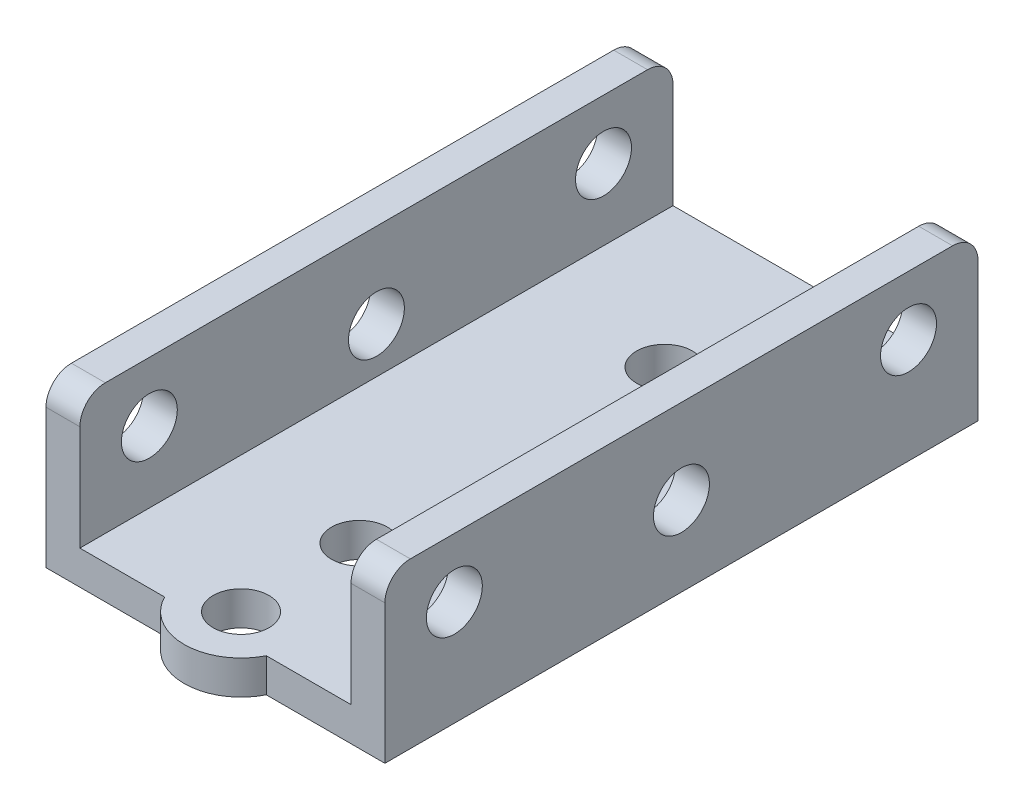
ISO-10303-21;
HEADER;
FILE_DESCRIPTION(('STEP AP214'),'2;1');
FILE_NAME('part.step','',(''),(''),'','','');
FILE_SCHEMA(('AUTOMOTIVE_DESIGN { 1 0 10303 214 1 1 1 1 }'));
ENDSEC;
DATA;
#1=APPLICATION_CONTEXT('core data for automotive mechanical design processes');
#2=APPLICATION_PROTOCOL_DEFINITION('international standard','automotive_design',2000,#1);
#3=PRODUCT_CONTEXT('',#1,'mechanical');
#4=PRODUCT('Part','Part','',(#3));
#5=PRODUCT_RELATED_PRODUCT_CATEGORY('part','',(#4));
#6=PRODUCT_DEFINITION_FORMATION('','',#4);
#7=PRODUCT_DEFINITION_CONTEXT('part definition',#1,'design');
#8=PRODUCT_DEFINITION('design','',#6,#7);
#9=PRODUCT_DEFINITION_SHAPE('','',#8);
#10=(LENGTH_UNIT() NAMED_UNIT(*) SI_UNIT(.MILLI.,.METRE.));
#11=(NAMED_UNIT(*) PLANE_ANGLE_UNIT() SI_UNIT($,.RADIAN.));
#12=(NAMED_UNIT(*) SI_UNIT($,.STERADIAN.) SOLID_ANGLE_UNIT());
#13=UNCERTAINTY_MEASURE_WITH_UNIT(LENGTH_MEASURE(1.E-05),#10,'distance_accuracy_value','');
#14=(GEOMETRIC_REPRESENTATION_CONTEXT(3) GLOBAL_UNCERTAINTY_ASSIGNED_CONTEXT((#13)) GLOBAL_UNIT_ASSIGNED_CONTEXT((#10,
#11,#12)) REPRESENTATION_CONTEXT('',''));
#15=CARTESIAN_POINT('',(0.,0.,0.));
#16=DIRECTION('',(0.,0.,1.));
#17=DIRECTION('',(1.,0.,0.));
#18=AXIS2_PLACEMENT_3D('',#15,#16,#17);
#19=CARTESIAN_POINT('',(0.,2.,17.5));
#20=DIRECTION('',(0.,0.,1.));
#21=DIRECTION('',(1.,0.,0.));
#22=AXIS2_PLACEMENT_3D('',#19,#20,#21);
#23=PLANE('',#22);
#24=DIRECTION('',(0.,1.,0.));
#25=VECTOR('',#24,1.);
#26=CARTESIAN_POINT('',(3.,-6.27831746917603,17.5));
#27=LINE('',#26,#25);
#28=CARTESIAN_POINT('',(3.,0.,17.5));
#29=VERTEX_POINT('',#28);
#30=CARTESIAN_POINT('',(3.,2.,17.5));
#31=VERTEX_POINT('',#30);
#32=EDGE_CURVE('E156',#29,#31,#27,.T.);
#33=ORIENTED_EDGE('',*,*,#32,.F.);
#34=DIRECTION('',(-1.,0.,0.));
#35=VECTOR('',#34,1.);
#36=CARTESIAN_POINT('',(0.,0.,17.5));
#37=LINE('',#36,#35);
#38=CARTESIAN_POINT('',(10.,0.,17.5));
#39=VERTEX_POINT('',#38);
#40=EDGE_CURVE('E204',#39,#29,#37,.T.);
#41=ORIENTED_EDGE('',*,*,#40,.F.);
#42=DIRECTION('',(0.,-1.,0.));
#43=VECTOR('',#42,1.);
#44=CARTESIAN_POINT('',(10.,9.7,17.5));
#45=LINE('',#44,#43);
#46=CARTESIAN_POINT('',(10.,8.2,17.5));
#47=VERTEX_POINT('',#46);
#48=EDGE_CURVE('E203',#47,#39,#45,.T.);
#49=ORIENTED_EDGE('',*,*,#48,.F.);
#50=DIRECTION('',(-1.,0.,0.));
#51=VECTOR('',#50,1.);
#52=CARTESIAN_POINT('',(0.,8.2,17.5));
#53=LINE('',#52,#51);
#54=CARTESIAN_POINT('',(8.,8.2,17.5));
#55=VERTEX_POINT('',#54);
#56=EDGE_CURVE('E54',#47,#55,#53,.T.);
#57=ORIENTED_EDGE('',*,*,#56,.T.);
#58=DIRECTION('',(0.,-1.,0.));
#59=VECTOR('',#58,1.);
#60=CARTESIAN_POINT('',(8.,9.7,17.5));
#61=LINE('',#60,#59);
#62=CARTESIAN_POINT('',(8.,2.,17.5));
#63=VERTEX_POINT('',#62);
#64=EDGE_CURVE('E265',#55,#63,#61,.T.);
#65=ORIENTED_EDGE('',*,*,#64,.T.);
#66=DIRECTION('',(-1.,0.,0.));
#67=VECTOR('',#66,1.);
#68=CARTESIAN_POINT('',(0.,2.,17.5));
#69=LINE('',#68,#67);
#70=EDGE_CURVE('E178',#63,#31,#69,.T.);
#71=ORIENTED_EDGE('',*,*,#70,.T.);
#72=EDGE_LOOP('',(#33,#41,#49,#57,#65,#71));
#73=FACE_BOUND('',#72,.T.);
#74=ADVANCED_FACE('F45',(#73),#23,.T.);
#75=CARTESIAN_POINT('',(0.,2.,-17.5));
#76=DIRECTION('',(0.,0.,1.));
#77=DIRECTION('',(1.,0.,0.));
#78=AXIS2_PLACEMENT_3D('',#75,#76,#77);
#79=PLANE('',#78);
#80=DIRECTION('',(0.,-1.,0.));
#81=VECTOR('',#80,1.);
#82=CARTESIAN_POINT('',(8.,9.7,-17.5));
#83=LINE('',#82,#81);
#84=CARTESIAN_POINT('',(8.,8.2,-17.5));
#85=VERTEX_POINT('',#84);
#86=CARTESIAN_POINT('',(8.,2.,-17.5));
#87=VERTEX_POINT('',#86);
#88=EDGE_CURVE('E275',#85,#87,#83,.T.);
#89=ORIENTED_EDGE('',*,*,#88,.F.);
#90=DIRECTION('',(-1.,0.,0.));
#91=VECTOR('',#90,1.);
#92=CARTESIAN_POINT('',(10.,8.2,-17.5));
#93=LINE('',#92,#91);
#94=CARTESIAN_POINT('',(10.,8.2,-17.5));
#95=VERTEX_POINT('',#94);
#96=EDGE_CURVE('E231',#85,#95,#93,.F.);
#97=ORIENTED_EDGE('',*,*,#96,.T.);
#98=DIRECTION('',(0.,-1.,0.));
#99=VECTOR('',#98,1.);
#100=CARTESIAN_POINT('',(10.,9.7,-17.5));
#101=LINE('',#100,#99);
#102=CARTESIAN_POINT('',(10.,0.,-17.5));
#103=VERTEX_POINT('',#102);
#104=EDGE_CURVE('E280',#95,#103,#101,.T.);
#105=ORIENTED_EDGE('',*,*,#104,.T.);
#106=DIRECTION('',(-1.,0.,0.));
#107=VECTOR('',#106,1.);
#108=CARTESIAN_POINT('',(0.,0.,-17.5));
#109=LINE('',#108,#107);
#110=CARTESIAN_POINT('',(-10.,0.,-17.5));
#111=VERTEX_POINT('',#110);
#112=EDGE_CURVE('E199',#103,#111,#109,.T.);
#113=ORIENTED_EDGE('',*,*,#112,.T.);
#114=DIRECTION('',(0.,-1.,0.));
#115=VECTOR('',#114,1.);
#116=CARTESIAN_POINT('',(-10.,9.7,-17.5));
#117=LINE('',#116,#115);
#118=CARTESIAN_POINT('',(-10.,8.2,-17.5));
#119=VERTEX_POINT('',#118);
#120=EDGE_CURVE('E303',#119,#111,#117,.T.);
#121=ORIENTED_EDGE('',*,*,#120,.F.);
#122=DIRECTION('',(-1.,0.,0.));
#123=VECTOR('',#122,1.);
#124=CARTESIAN_POINT('',(-8.,8.2,-17.5));
#125=LINE('',#124,#123);
#126=CARTESIAN_POINT('',(-8.,8.2,-17.5));
#127=VERTEX_POINT('',#126);
#128=EDGE_CURVE('E228',#119,#127,#125,.F.);
#129=ORIENTED_EDGE('',*,*,#128,.T.);
#130=DIRECTION('',(0.,-1.,0.));
#131=VECTOR('',#130,1.);
#132=CARTESIAN_POINT('',(-8.,9.7,-17.5));
#133=LINE('',#132,#131);
#134=CARTESIAN_POINT('',(-8.,2.,-17.5));
#135=VERTEX_POINT('',#134);
#136=EDGE_CURVE('E297',#127,#135,#133,.T.);
#137=ORIENTED_EDGE('',*,*,#136,.T.);
#138=DIRECTION('',(-1.,0.,0.));
#139=VECTOR('',#138,1.);
#140=CARTESIAN_POINT('',(0.,2.,-17.5));
#141=LINE('',#140,#139);
#142=EDGE_CURVE('E183',#87,#135,#141,.T.);
#143=ORIENTED_EDGE('',*,*,#142,.F.);
#144=EDGE_LOOP('',(#89,#97,#105,#113,#121,#129,#137,#143));
#145=FACE_BOUND('',#144,.T.);
#146=ADVANCED_FACE('F294',(#145),#79,.F.);
#147=DIRECTION('',(0.,1.,0.));
#148=VECTOR('',#147,1.);
#149=CARTESIAN_POINT('',(-3.,-6.27831746917603,17.5));
#150=LINE('',#149,#148);
#151=CARTESIAN_POINT('',(-3.,0.,17.5));
#152=VERTEX_POINT('',#151);
#153=CARTESIAN_POINT('',(-3.,2.,17.5));
#154=VERTEX_POINT('',#153);
#155=EDGE_CURVE('E153',#152,#154,#150,.T.);
#156=ORIENTED_EDGE('',*,*,#155,.T.);
#157=CARTESIAN_POINT('',(-8.,2.,17.5));
#158=VERTEX_POINT('',#157);
#159=EDGE_CURVE('E166',#154,#158,#69,.T.);
#160=ORIENTED_EDGE('',*,*,#159,.T.);
#161=DIRECTION('',(0.,-1.,0.));
#162=VECTOR('',#161,1.);
#163=CARTESIAN_POINT('',(-8.,9.7,17.5));
#164=LINE('',#163,#162);
#165=CARTESIAN_POINT('',(-8.,8.2,17.5));
#166=VERTEX_POINT('',#165);
#167=EDGE_CURVE('E302',#166,#158,#164,.T.);
#168=ORIENTED_EDGE('',*,*,#167,.F.);
#169=DIRECTION('',(-1.,0.,0.));
#170=VECTOR('',#169,1.);
#171=CARTESIAN_POINT('',(0.,8.2,17.5));
#172=LINE('',#171,#170);
#173=CARTESIAN_POINT('',(-10.,8.2,17.5));
#174=VERTEX_POINT('',#173);
#175=EDGE_CURVE('E257',#166,#174,#172,.T.);
#176=ORIENTED_EDGE('',*,*,#175,.T.);
#177=DIRECTION('',(0.,-1.,0.));
#178=VECTOR('',#177,1.);
#179=CARTESIAN_POINT('',(-10.,9.7,17.5));
#180=LINE('',#179,#178);
#181=CARTESIAN_POINT('',(-10.,0.,17.5));
#182=VERTEX_POINT('',#181);
#183=EDGE_CURVE('E307',#174,#182,#180,.T.);
#184=ORIENTED_EDGE('',*,*,#183,.T.);
#185=EDGE_CURVE('E168',#152,#182,#37,.T.);
#186=ORIENTED_EDGE('',*,*,#185,.F.);
#187=EDGE_LOOP('',(#156,#160,#168,#176,#184,#186));
#188=FACE_BOUND('',#187,.T.);
#189=ADVANCED_FACE('F165',(#188),#23,.T.);
#190=CARTESIAN_POINT('',(0.,2.,-9.));
#191=DIRECTION('',(0.,-1.,0.));
#192=DIRECTION('',(0.,0.,-1.));
#193=AXIS2_PLACEMENT_3D('',#190,#191,#192);
#194=CYLINDRICAL_SURFACE('',#193,1.65);
#195=CARTESIAN_POINT('',(0.,2.,-9.));
#196=DIRECTION('',(0.,1.,0.));
#197=DIRECTION('',(0.,0.,1.));
#198=AXIS2_PLACEMENT_3D('',#195,#196,#197);
#199=CIRCLE('',#198,1.65);
#200=CARTESIAN_POINT('',(0.,2.,-7.35));
#201=VERTEX_POINT('',#200);
#202=EDGE_CURVE('E190',#201,#201,#199,.T.);
#203=ORIENTED_EDGE('',*,*,#202,.T.);
#204=EDGE_LOOP('',(#203));
#205=FACE_BOUND('',#204,.T.);
#206=CARTESIAN_POINT('',(0.,0.,-9.));
#207=DIRECTION('',(0.,1.,0.));
#208=DIRECTION('',(0.,0.,1.));
#209=AXIS2_PLACEMENT_3D('',#206,#207,#208);
#210=CIRCLE('',#209,1.65);
#211=CARTESIAN_POINT('',(0.,0.,-7.35));
#212=VERTEX_POINT('',#211);
#213=EDGE_CURVE('E208',#212,#212,#210,.T.);
#214=ORIENTED_EDGE('',*,*,#213,.F.);
#215=EDGE_LOOP('',(#214));
#216=FACE_BOUND('',#215,.T.);
#217=ADVANCED_FACE('F358',(#205,#216),#194,.F.);
#218=CARTESIAN_POINT('',(0.,2.,9.));
#219=DIRECTION('',(0.,-1.,0.));
#220=DIRECTION('',(0.,0.,-1.));
#221=AXIS2_PLACEMENT_3D('',#218,#219,#220);
#222=CYLINDRICAL_SURFACE('',#221,1.65);
#223=CARTESIAN_POINT('',(0.,2.,9.));
#224=DIRECTION('',(0.,1.,0.));
#225=DIRECTION('',(0.,0.,1.));
#226=AXIS2_PLACEMENT_3D('',#223,#224,#225);
#227=CIRCLE('',#226,1.65);
#228=CARTESIAN_POINT('',(0.,2.,10.65));
#229=VERTEX_POINT('',#228);
#230=EDGE_CURVE('E194',#229,#229,#227,.F.);
#231=ORIENTED_EDGE('',*,*,#230,.F.);
#232=EDGE_LOOP('',(#231));
#233=FACE_BOUND('',#232,.T.);
#234=CARTESIAN_POINT('',(0.,0.,9.));
#235=DIRECTION('',(0.,1.,0.));
#236=DIRECTION('',(0.,0.,1.));
#237=AXIS2_PLACEMENT_3D('',#234,#235,#236);
#238=CIRCLE('',#237,1.65);
#239=CARTESIAN_POINT('',(0.,0.,10.65));
#240=VERTEX_POINT('',#239);
#241=EDGE_CURVE('E212',#240,#240,#238,.F.);
#242=ORIENTED_EDGE('',*,*,#241,.T.);
#243=EDGE_LOOP('',(#242));
#244=FACE_BOUND('',#243,.T.);
#245=ADVANCED_FACE('F362',(#233,#244),#222,.F.);
#246=CARTESIAN_POINT('',(0.,2.,0.));
#247=DIRECTION('',(0.,1.,0.));
#248=DIRECTION('',(0.,0.,1.));
#249=AXIS2_PLACEMENT_3D('',#246,#247,#248);
#250=PLANE('',#249);
#251=ORIENTED_EDGE('',*,*,#159,.F.);
#252=CARTESIAN_POINT('',(0.,2.,15.99));
#253=DIRECTION('',(0.,1.,0.));
#254=DIRECTION('',(0.,0.,1.));
#255=AXIS2_PLACEMENT_3D('',#252,#253,#254);
#256=CIRCLE('',#255,3.35858601199969);
#257=EDGE_CURVE('E150',#154,#31,#256,.T.);
#258=ORIENTED_EDGE('',*,*,#257,.T.);
#259=ORIENTED_EDGE('',*,*,#70,.F.);
#260=DIRECTION('',(0.,0.,1.));
#261=VECTOR('',#260,1.);
#262=CARTESIAN_POINT('',(8.,2.,0.));
#263=LINE('',#262,#261);
#264=EDGE_CURVE('E182',#87,#63,#263,.T.);
#265=ORIENTED_EDGE('',*,*,#264,.F.);
#266=ORIENTED_EDGE('',*,*,#142,.T.);
#267=DIRECTION('',(0.,0.,1.));
#268=VECTOR('',#267,1.);
#269=CARTESIAN_POINT('',(-8.,2.,0.));
#270=LINE('',#269,#268);
#271=EDGE_CURVE('E176',#135,#158,#270,.T.);
#272=ORIENTED_EDGE('',*,*,#271,.T.);
#273=EDGE_LOOP('',(#251,#258,#259,#265,#266,#272));
#274=FACE_BOUND('',#273,.T.);
#275=CARTESIAN_POINT('',(0.,2.,15.99));
#276=DIRECTION('',(0.,1.,0.));
#277=DIRECTION('',(0.,0.,1.));
#278=AXIS2_PLACEMENT_3D('',#275,#276,#277);
#279=CIRCLE('',#278,1.65);
#280=CARTESIAN_POINT('',(0.,2.,17.64));
#281=VERTEX_POINT('',#280);
#282=EDGE_CURVE('E420',#281,#281,#279,.T.);
#283=ORIENTED_EDGE('',*,*,#282,.F.);
#284=EDGE_LOOP('',(#283));
#285=FACE_BOUND('',#284,.T.);
#286=ORIENTED_EDGE('',*,*,#202,.F.);
#287=EDGE_LOOP('',(#286));
#288=FACE_BOUND('',#287,.T.);
#289=ORIENTED_EDGE('',*,*,#230,.T.);
#290=EDGE_LOOP('',(#289));
#291=FACE_BOUND('',#290,.T.);
#292=ADVANCED_FACE('F172',(#274,#285,#288,#291),#250,.T.);
#293=CARTESIAN_POINT('',(0.,0.,0.));
#294=DIRECTION('',(0.,1.,0.));
#295=DIRECTION('',(0.,0.,1.));
#296=AXIS2_PLACEMENT_3D('',#293,#294,#295);
#297=PLANE('',#296);
#298=CARTESIAN_POINT('',(0.,0.,15.99));
#299=DIRECTION('',(0.,1.,0.));
#300=DIRECTION('',(0.,0.,1.));
#301=AXIS2_PLACEMENT_3D('',#298,#299,#300);
#302=CIRCLE('',#301,3.35858601199969);
#303=EDGE_CURVE('E418',#29,#152,#302,.F.);
#304=ORIENTED_EDGE('',*,*,#303,.T.);
#305=ORIENTED_EDGE('',*,*,#185,.T.);
#306=DIRECTION('',(0.,0.,-1.));
#307=VECTOR('',#306,1.);
#308=CARTESIAN_POINT('',(-10.,0.,0.));
#309=LINE('',#308,#307);
#310=EDGE_CURVE('E331',#182,#111,#309,.T.);
#311=ORIENTED_EDGE('',*,*,#310,.T.);
#312=ORIENTED_EDGE('',*,*,#112,.F.);
#313=DIRECTION('',(0.,0.,-1.));
#314=VECTOR('',#313,1.);
#315=CARTESIAN_POINT('',(10.,0.,0.));
#316=LINE('',#315,#314);
#317=EDGE_CURVE('E285',#39,#103,#316,.T.);
#318=ORIENTED_EDGE('',*,*,#317,.F.);
#319=ORIENTED_EDGE('',*,*,#40,.T.);
#320=EDGE_LOOP('',(#304,#305,#311,#312,#318,#319));
#321=FACE_BOUND('',#320,.T.);
#322=CARTESIAN_POINT('',(0.,0.,15.99));
#323=DIRECTION('',(0.,1.,0.));
#324=DIRECTION('',(0.,0.,1.));
#325=AXIS2_PLACEMENT_3D('',#322,#323,#324);
#326=CIRCLE('',#325,1.65);
#327=CARTESIAN_POINT('',(0.,0.,17.64));
#328=VERTEX_POINT('',#327);
#329=EDGE_CURVE('E11',#328,#328,#326,.T.);
#330=ORIENTED_EDGE('',*,*,#329,.T.);
#331=EDGE_LOOP('',(#330));
#332=FACE_BOUND('',#331,.T.);
#333=ORIENTED_EDGE('',*,*,#213,.T.);
#334=EDGE_LOOP('',(#333));
#335=FACE_BOUND('',#334,.T.);
#336=ORIENTED_EDGE('',*,*,#241,.F.);
#337=EDGE_LOOP('',(#336));
#338=FACE_BOUND('',#337,.T.);
#339=ADVANCED_FACE('F327',(#321,#332,#335,#338),#297,.F.);
#340=CARTESIAN_POINT('',(8.,9.7,0.));
#341=DIRECTION('',(1.,0.,0.));
#342=DIRECTION('',(0.,0.,-1.));
#343=AXIS2_PLACEMENT_3D('',#340,#341,#342);
#344=PLANE('',#343);
#345=CARTESIAN_POINT('',(8.,6.2,-13.4));
#346=DIRECTION('',(1.,0.,0.));
#347=DIRECTION('',(0.,0.,-1.));
#348=AXIS2_PLACEMENT_3D('',#345,#346,#347);
#349=CIRCLE('',#348,1.65);
#350=CARTESIAN_POINT('',(8.,6.2,-15.05));
#351=VERTEX_POINT('',#350);
#352=EDGE_CURVE('E162',#351,#351,#349,.T.);
#353=ORIENTED_EDGE('',*,*,#352,.T.);
#354=EDGE_LOOP('',(#353));
#355=FACE_BOUND('',#354,.T.);
#356=CARTESIAN_POINT('',(8.,4.7,0.));
#357=DIRECTION('',(1.,0.,0.));
#358=DIRECTION('',(0.,0.,-1.));
#359=AXIS2_PLACEMENT_3D('',#356,#357,#358);
#360=CIRCLE('',#359,1.65);
#361=CARTESIAN_POINT('',(8.,4.7,-1.65000000000001));
#362=VERTEX_POINT('',#361);
#363=EDGE_CURVE('E384',#362,#362,#360,.T.);
#364=ORIENTED_EDGE('',*,*,#363,.T.);
#365=EDGE_LOOP('',(#364));
#366=FACE_BOUND('',#365,.T.);
#367=CARTESIAN_POINT('',(8.,6.2,13.4));
#368=DIRECTION('',(1.,0.,0.));
#369=DIRECTION('',(0.,0.,-1.));
#370=AXIS2_PLACEMENT_3D('',#367,#368,#369);
#371=CIRCLE('',#370,1.65);
#372=CARTESIAN_POINT('',(8.,6.2,11.75));
#373=VERTEX_POINT('',#372);
#374=EDGE_CURVE('E387',#373,#373,#371,.T.);
#375=ORIENTED_EDGE('',*,*,#374,.T.);
#376=EDGE_LOOP('',(#375));
#377=FACE_BOUND('',#376,.T.);
#378=DIRECTION('',(0.,0.,1.));
#379=VECTOR('',#378,1.);
#380=CARTESIAN_POINT('',(8.,9.7,0.));
#381=LINE('',#380,#379);
#382=CARTESIAN_POINT('',(8.,9.7,-16.));
#383=VERTEX_POINT('',#382);
#384=CARTESIAN_POINT('',(8.,9.7,16.));
#385=VERTEX_POINT('',#384);
#386=EDGE_CURVE('E276',#383,#385,#381,.T.);
#387=ORIENTED_EDGE('',*,*,#386,.F.);
#388=CARTESIAN_POINT('',(8.,8.2,-16.));
#389=DIRECTION('',(1.,0.,0.));
#390=DIRECTION('',(0.,0.,-1.));
#391=AXIS2_PLACEMENT_3D('',#388,#389,#390);
#392=CIRCLE('',#391,1.5);
#393=EDGE_CURVE('E225',#383,#85,#392,.F.);
#394=ORIENTED_EDGE('',*,*,#393,.T.);
#395=ORIENTED_EDGE('',*,*,#88,.T.);
#396=ORIENTED_EDGE('',*,*,#264,.T.);
#397=ORIENTED_EDGE('',*,*,#64,.F.);
#398=CARTESIAN_POINT('',(8.,8.2,16.));
#399=DIRECTION('',(1.,0.,0.));
#400=DIRECTION('',(0.,0.,-1.));
#401=AXIS2_PLACEMENT_3D('',#398,#399,#400);
#402=CIRCLE('',#401,1.5);
#403=EDGE_CURVE('E222',#55,#385,#402,.F.);
#404=ORIENTED_EDGE('',*,*,#403,.T.);
#405=EDGE_LOOP('',(#387,#394,#395,#396,#397,#404));
#406=FACE_BOUND('',#405,.T.);
#407=ADVANCED_FACE('F271',(#355,#366,#377,#406),#344,.F.);
#408=CARTESIAN_POINT('',(10.,9.7,0.));
#409=DIRECTION('',(-1.,0.,0.));
#410=DIRECTION('',(0.,0.,1.));
#411=AXIS2_PLACEMENT_3D('',#408,#409,#410);
#412=PLANE('',#411);
#413=CARTESIAN_POINT('',(10.,6.2,-13.4));
#414=DIRECTION('',(-1.,0.,0.));
#415=DIRECTION('',(0.,0.,1.));
#416=AXIS2_PLACEMENT_3D('',#413,#414,#415);
#417=CIRCLE('',#416,1.65);
#418=CARTESIAN_POINT('',(10.,6.2,-11.75));
#419=VERTEX_POINT('',#418);
#420=EDGE_CURVE('E412',#419,#419,#417,.T.);
#421=ORIENTED_EDGE('',*,*,#420,.T.);
#422=EDGE_LOOP('',(#421));
#423=FACE_BOUND('',#422,.T.);
#424=CARTESIAN_POINT('',(10.,4.7,0.));
#425=DIRECTION('',(-1.,0.,0.));
#426=DIRECTION('',(0.,0.,1.));
#427=AXIS2_PLACEMENT_3D('',#424,#425,#426);
#428=CIRCLE('',#427,1.65);
#429=CARTESIAN_POINT('',(10.,4.7,1.64999999999999));
#430=VERTEX_POINT('',#429);
#431=EDGE_CURVE('E396',#430,#430,#428,.T.);
#432=ORIENTED_EDGE('',*,*,#431,.T.);
#433=EDGE_LOOP('',(#432));
#434=FACE_BOUND('',#433,.T.);
#435=CARTESIAN_POINT('',(10.,6.2,13.4));
#436=DIRECTION('',(-1.,0.,0.));
#437=DIRECTION('',(0.,0.,1.));
#438=AXIS2_PLACEMENT_3D('',#435,#436,#437);
#439=CIRCLE('',#438,1.65);
#440=CARTESIAN_POINT('',(10.,6.2,15.05));
#441=VERTEX_POINT('',#440);
#442=EDGE_CURVE('E391',#441,#441,#439,.T.);
#443=ORIENTED_EDGE('',*,*,#442,.T.);
#444=EDGE_LOOP('',(#443));
#445=FACE_BOUND('',#444,.T.);
#446=ORIENTED_EDGE('',*,*,#104,.F.);
#447=CARTESIAN_POINT('',(10.,8.2,-16.));
#448=DIRECTION('',(-1.,0.,0.));
#449=DIRECTION('',(0.,0.,1.));
#450=AXIS2_PLACEMENT_3D('',#447,#448,#449);
#451=CIRCLE('',#450,1.5);
#452=CARTESIAN_POINT('',(10.,9.7,-16.));
#453=VERTEX_POINT('',#452);
#454=EDGE_CURVE('E237',#95,#453,#451,.F.);
#455=ORIENTED_EDGE('',*,*,#454,.T.);
#456=DIRECTION('',(0.,0.,-1.));
#457=VECTOR('',#456,1.);
#458=CARTESIAN_POINT('',(10.,9.7,0.));
#459=LINE('',#458,#457);
#460=CARTESIAN_POINT('',(10.,9.7,16.));
#461=VERTEX_POINT('',#460);
#462=EDGE_CURVE('E282',#461,#453,#459,.T.);
#463=ORIENTED_EDGE('',*,*,#462,.F.);
#464=CARTESIAN_POINT('',(10.,8.2,16.));
#465=DIRECTION('',(-1.,0.,0.));
#466=DIRECTION('',(0.,0.,1.));
#467=AXIS2_PLACEMENT_3D('',#464,#465,#466);
#468=CIRCLE('',#467,1.5);
#469=EDGE_CURVE('E234',#461,#47,#468,.F.);
#470=ORIENTED_EDGE('',*,*,#469,.T.);
#471=ORIENTED_EDGE('',*,*,#48,.T.);
#472=ORIENTED_EDGE('',*,*,#317,.T.);
#473=EDGE_LOOP('',(#446,#455,#463,#470,#471,#472));
#474=FACE_BOUND('',#473,.T.);
#475=ADVANCED_FACE('F323',(#423,#434,#445,#474),#412,.F.);
#476=CARTESIAN_POINT('',(0.,9.7,0.));
#477=DIRECTION('',(0.,1.,0.));
#478=DIRECTION('',(0.,0.,1.));
#479=AXIS2_PLACEMENT_3D('',#476,#477,#478);
#480=PLANE('',#479);
#481=ORIENTED_EDGE('',*,*,#462,.T.);
#482=DIRECTION('',(-1.,0.,0.));
#483=VECTOR('',#482,1.);
#484=CARTESIAN_POINT('',(8.,9.7,-16.));
#485=LINE('',#484,#483);
#486=EDGE_CURVE('E218',#453,#383,#485,.T.);
#487=ORIENTED_EDGE('',*,*,#486,.T.);
#488=ORIENTED_EDGE('',*,*,#386,.T.);
#489=DIRECTION('',(-1.,0.,0.));
#490=VECTOR('',#489,1.);
#491=CARTESIAN_POINT('',(0.,9.7,16.));
#492=LINE('',#491,#490);
#493=EDGE_CURVE('E198',#385,#461,#492,.F.);
#494=ORIENTED_EDGE('',*,*,#493,.T.);
#495=EDGE_LOOP('',(#481,#487,#488,#494));
#496=FACE_BOUND('',#495,.T.);
#497=ADVANCED_FACE('F336',(#496),#480,.T.);
#498=CARTESIAN_POINT('',(-8.,9.7,0.));
#499=DIRECTION('',(1.,0.,0.));
#500=DIRECTION('',(0.,0.,-1.));
#501=AXIS2_PLACEMENT_3D('',#498,#499,#500);
#502=PLANE('',#501);
#503=CARTESIAN_POINT('',(-8.,6.2,-13.4));
#504=DIRECTION('',(1.,0.,0.));
#505=DIRECTION('',(0.,0.,-1.));
#506=AXIS2_PLACEMENT_3D('',#503,#504,#505);
#507=CIRCLE('',#506,1.65);
#508=CARTESIAN_POINT('',(-8.,6.2,-15.05));
#509=VERTEX_POINT('',#508);
#510=EDGE_CURVE('E408',#509,#509,#507,.T.);
#511=ORIENTED_EDGE('',*,*,#510,.F.);
#512=EDGE_LOOP('',(#511));
#513=FACE_BOUND('',#512,.T.);
#514=CARTESIAN_POINT('',(-8.,4.7,0.));
#515=DIRECTION('',(1.,0.,0.));
#516=DIRECTION('',(0.,0.,-1.));
#517=AXIS2_PLACEMENT_3D('',#514,#515,#516);
#518=CIRCLE('',#517,1.65);
#519=CARTESIAN_POINT('',(-8.,4.7,-1.65000000000001));
#520=VERTEX_POINT('',#519);
#521=EDGE_CURVE('E390',#520,#520,#518,.T.);
#522=ORIENTED_EDGE('',*,*,#521,.F.);
#523=EDGE_LOOP('',(#522));
#524=FACE_BOUND('',#523,.T.);
#525=CARTESIAN_POINT('',(-8.,6.2,13.4));
#526=DIRECTION('',(1.,0.,0.));
#527=DIRECTION('',(0.,0.,-1.));
#528=AXIS2_PLACEMENT_3D('',#525,#526,#527);
#529=CIRCLE('',#528,1.65);
#530=CARTESIAN_POINT('',(-8.,6.2,11.75));
#531=VERTEX_POINT('',#530);
#532=EDGE_CURVE('E399',#531,#531,#529,.T.);
#533=ORIENTED_EDGE('',*,*,#532,.F.);
#534=EDGE_LOOP('',(#533));
#535=FACE_BOUND('',#534,.T.);
#536=ORIENTED_EDGE('',*,*,#136,.F.);
#537=CARTESIAN_POINT('',(-8.,8.2,-16.));
#538=DIRECTION('',(1.,0.,0.));
#539=DIRECTION('',(0.,0.,-1.));
#540=AXIS2_PLACEMENT_3D('',#537,#538,#539);
#541=CIRCLE('',#540,1.5);
#542=CARTESIAN_POINT('',(-8.,9.7,-16.));
#543=VERTEX_POINT('',#542);
#544=EDGE_CURVE('E254',#127,#543,#541,.T.);
#545=ORIENTED_EDGE('',*,*,#544,.T.);
#546=DIRECTION('',(0.,0.,1.));
#547=VECTOR('',#546,1.);
#548=CARTESIAN_POINT('',(-8.,9.7,0.));
#549=LINE('',#548,#547);
#550=CARTESIAN_POINT('',(-8.,9.7,16.));
#551=VERTEX_POINT('',#550);
#552=EDGE_CURVE('E431',#543,#551,#549,.T.);
#553=ORIENTED_EDGE('',*,*,#552,.T.);
#554=CARTESIAN_POINT('',(-8.,8.2,16.));
#555=DIRECTION('',(1.,0.,0.));
#556=DIRECTION('',(0.,0.,-1.));
#557=AXIS2_PLACEMENT_3D('',#554,#555,#556);
#558=CIRCLE('',#557,1.5);
#559=EDGE_CURVE('E61',#551,#166,#558,.T.);
#560=ORIENTED_EDGE('',*,*,#559,.T.);
#561=ORIENTED_EDGE('',*,*,#167,.T.);
#562=ORIENTED_EDGE('',*,*,#271,.F.);
#563=EDGE_LOOP('',(#536,#545,#553,#560,#561,#562));
#564=FACE_BOUND('',#563,.T.);
#565=ADVANCED_FACE('F305',(#513,#524,#535,#564),#502,.T.);
#566=CARTESIAN_POINT('',(-10.,9.7,0.));
#567=DIRECTION('',(-1.,0.,0.));
#568=DIRECTION('',(0.,0.,1.));
#569=AXIS2_PLACEMENT_3D('',#566,#567,#568);
#570=PLANE('',#569);
#571=CARTESIAN_POINT('',(-10.,6.2,-13.4));
#572=DIRECTION('',(1.,0.,0.));
#573=DIRECTION('',(0.,0.,-1.));
#574=AXIS2_PLACEMENT_3D('',#571,#572,#573);
#575=CIRCLE('',#574,1.65);
#576=CARTESIAN_POINT('',(-10.,6.2,-15.05));
#577=VERTEX_POINT('',#576);
#578=EDGE_CURVE('E682',#577,#577,#575,.T.);
#579=ORIENTED_EDGE('',*,*,#578,.T.);
#580=EDGE_LOOP('',(#579));
#581=FACE_BOUND('',#580,.T.);
#582=CARTESIAN_POINT('',(-10.,4.7,0.));
#583=DIRECTION('',(1.,0.,0.));
#584=DIRECTION('',(0.,0.,-1.));
#585=AXIS2_PLACEMENT_3D('',#582,#583,#584);
#586=CIRCLE('',#585,1.65);
#587=CARTESIAN_POINT('',(-10.,4.7,-1.65000000000001));
#588=VERTEX_POINT('',#587);
#589=EDGE_CURVE('E684',#588,#588,#586,.T.);
#590=ORIENTED_EDGE('',*,*,#589,.T.);
#591=EDGE_LOOP('',(#590));
#592=FACE_BOUND('',#591,.T.);
#593=CARTESIAN_POINT('',(-10.,6.2,13.4));
#594=DIRECTION('',(1.,0.,0.));
#595=DIRECTION('',(0.,0.,-1.));
#596=AXIS2_PLACEMENT_3D('',#593,#594,#595);
#597=CIRCLE('',#596,1.65);
#598=CARTESIAN_POINT('',(-10.,6.2,11.75));
#599=VERTEX_POINT('',#598);
#600=EDGE_CURVE('E690',#599,#599,#597,.T.);
#601=ORIENTED_EDGE('',*,*,#600,.T.);
#602=EDGE_LOOP('',(#601));
#603=FACE_BOUND('',#602,.T.);
#604=DIRECTION('',(0.,0.,-1.));
#605=VECTOR('',#604,1.);
#606=CARTESIAN_POINT('',(-10.,9.7,0.));
#607=LINE('',#606,#605);
#608=CARTESIAN_POINT('',(-10.,9.7,16.));
#609=VERTEX_POINT('',#608);
#610=CARTESIAN_POINT('',(-10.,9.7,-16.));
#611=VERTEX_POINT('',#610);
#612=EDGE_CURVE('E427',#609,#611,#607,.T.);
#613=ORIENTED_EDGE('',*,*,#612,.T.);
#614=CARTESIAN_POINT('',(-10.,8.2,-16.));
#615=DIRECTION('',(-1.,0.,0.));
#616=DIRECTION('',(0.,0.,1.));
#617=AXIS2_PLACEMENT_3D('',#614,#615,#616);
#618=CIRCLE('',#617,1.5);
#619=EDGE_CURVE('E249',#611,#119,#618,.T.);
#620=ORIENTED_EDGE('',*,*,#619,.T.);
#621=ORIENTED_EDGE('',*,*,#120,.T.);
#622=ORIENTED_EDGE('',*,*,#310,.F.);
#623=ORIENTED_EDGE('',*,*,#183,.F.);
#624=CARTESIAN_POINT('',(-10.,8.2,16.));
#625=DIRECTION('',(-1.,0.,0.));
#626=DIRECTION('',(0.,0.,1.));
#627=AXIS2_PLACEMENT_3D('',#624,#625,#626);
#628=CIRCLE('',#627,1.5);
#629=EDGE_CURVE('E69',#174,#609,#628,.T.);
#630=ORIENTED_EDGE('',*,*,#629,.T.);
#631=EDGE_LOOP('',(#613,#620,#621,#622,#623,#630));
#632=FACE_BOUND('',#631,.T.);
#633=ADVANCED_FACE('F343',(#581,#592,#603,#632),#570,.T.);
#634=CARTESIAN_POINT('',(0.,9.7,0.));
#635=DIRECTION('',(0.,1.,0.));
#636=DIRECTION('',(0.,0.,1.));
#637=AXIS2_PLACEMENT_3D('',#634,#635,#636);
#638=PLANE('',#637);
#639=ORIENTED_EDGE('',*,*,#552,.F.);
#640=DIRECTION('',(-1.,0.,0.));
#641=VECTOR('',#640,1.);
#642=CARTESIAN_POINT('',(-10.,9.7,-16.));
#643=LINE('',#642,#641);
#644=EDGE_CURVE('E243',#543,#611,#643,.T.);
#645=ORIENTED_EDGE('',*,*,#644,.T.);
#646=ORIENTED_EDGE('',*,*,#612,.F.);
#647=DIRECTION('',(-1.,0.,0.));
#648=VECTOR('',#647,1.);
#649=CARTESIAN_POINT('',(0.,9.7,16.));
#650=LINE('',#649,#648);
#651=EDGE_CURVE('E240',#609,#551,#650,.F.);
#652=ORIENTED_EDGE('',*,*,#651,.T.);
#653=EDGE_LOOP('',(#639,#645,#646,#652));
#654=FACE_BOUND('',#653,.T.);
#655=ADVANCED_FACE('F444',(#654),#638,.T.);
#656=CARTESIAN_POINT('',(0.,8.2,-16.));
#657=DIRECTION('',(1.,0.,0.));
#658=DIRECTION('',(0.,0.,-1.));
#659=AXIS2_PLACEMENT_3D('',#656,#657,#658);
#660=CYLINDRICAL_SURFACE('',#659,1.5);
#661=ORIENTED_EDGE('',*,*,#454,.F.);
#662=ORIENTED_EDGE('',*,*,#96,.F.);
#663=ORIENTED_EDGE('',*,*,#393,.F.);
#664=ORIENTED_EDGE('',*,*,#486,.F.);
#665=EDGE_LOOP('',(#661,#662,#663,#664));
#666=FACE_BOUND('',#665,.T.);
#667=ADVANCED_FACE('F333',(#666),#660,.T.);
#668=CARTESIAN_POINT('',(0.,8.2,-16.));
#669=DIRECTION('',(1.,0.,0.));
#670=DIRECTION('',(0.,0.,-1.));
#671=AXIS2_PLACEMENT_3D('',#668,#669,#670);
#672=CYLINDRICAL_SURFACE('',#671,1.5);
#673=ORIENTED_EDGE('',*,*,#544,.F.);
#674=ORIENTED_EDGE('',*,*,#128,.F.);
#675=ORIENTED_EDGE('',*,*,#619,.F.);
#676=ORIENTED_EDGE('',*,*,#644,.F.);
#677=EDGE_LOOP('',(#673,#674,#675,#676));
#678=FACE_BOUND('',#677,.T.);
#679=ADVANCED_FACE('F441',(#678),#672,.T.);
#680=CARTESIAN_POINT('',(0.,8.2,16.));
#681=DIRECTION('',(-1.,0.,0.));
#682=DIRECTION('',(0.,0.,1.));
#683=AXIS2_PLACEMENT_3D('',#680,#681,#682);
#684=CYLINDRICAL_SURFACE('',#683,1.5);
#685=ORIENTED_EDGE('',*,*,#469,.F.);
#686=ORIENTED_EDGE('',*,*,#493,.F.);
#687=ORIENTED_EDGE('',*,*,#403,.F.);
#688=ORIENTED_EDGE('',*,*,#56,.F.);
#689=EDGE_LOOP('',(#685,#686,#687,#688));
#690=FACE_BOUND('',#689,.T.);
#691=ADVANCED_FACE('F335',(#690),#684,.T.);
#692=CARTESIAN_POINT('',(0.,8.2,16.));
#693=DIRECTION('',(-1.,0.,0.));
#694=DIRECTION('',(0.,0.,1.));
#695=AXIS2_PLACEMENT_3D('',#692,#693,#694);
#696=CYLINDRICAL_SURFACE('',#695,1.5);
#697=ORIENTED_EDGE('',*,*,#559,.F.);
#698=ORIENTED_EDGE('',*,*,#651,.F.);
#699=ORIENTED_EDGE('',*,*,#629,.F.);
#700=ORIENTED_EDGE('',*,*,#175,.F.);
#701=EDGE_LOOP('',(#697,#698,#699,#700));
#702=FACE_BOUND('',#701,.T.);
#703=ADVANCED_FACE('F47',(#702),#696,.T.);
#704=CARTESIAN_POINT('',(0.,-8.,15.99));
#705=DIRECTION('',(0.,1.,0.));
#706=DIRECTION('',(0.,0.,1.));
#707=AXIS2_PLACEMENT_3D('',#704,#705,#706);
#708=CYLINDRICAL_SURFACE('',#707,1.65);
#709=ORIENTED_EDGE('',*,*,#329,.F.);
#710=EDGE_LOOP('',(#709));
#711=FACE_BOUND('',#710,.T.);
#712=ORIENTED_EDGE('',*,*,#282,.T.);
#713=EDGE_LOOP('',(#712));
#714=FACE_BOUND('',#713,.T.);
#715=ADVANCED_FACE('F446',(#711,#714),#708,.F.);
#716=CARTESIAN_POINT('',(0.,-6.27831746917603,15.99));
#717=DIRECTION('',(0.,1.,0.));
#718=DIRECTION('',(0.,0.,1.));
#719=AXIS2_PLACEMENT_3D('',#716,#717,#718);
#720=CYLINDRICAL_SURFACE('',#719,3.35858601199969);
#721=ORIENTED_EDGE('',*,*,#303,.F.);
#722=ORIENTED_EDGE('',*,*,#32,.T.);
#723=ORIENTED_EDGE('',*,*,#257,.F.);
#724=ORIENTED_EDGE('',*,*,#155,.F.);
#725=EDGE_LOOP('',(#721,#722,#723,#724));
#726=FACE_BOUND('',#725,.T.);
#727=ADVANCED_FACE('F152',(#726),#720,.T.);
#728=CARTESIAN_POINT('',(-10.,6.2,13.4));
#729=DIRECTION('',(1.,0.,0.));
#730=DIRECTION('',(0.,0.,-1.));
#731=AXIS2_PLACEMENT_3D('',#728,#729,#730);
#732=CYLINDRICAL_SURFACE('',#731,1.65);
#733=ORIENTED_EDGE('',*,*,#532,.T.);
#734=EDGE_LOOP('',(#733));
#735=FACE_BOUND('',#734,.T.);
#736=ORIENTED_EDGE('',*,*,#600,.F.);
#737=EDGE_LOOP('',(#736));
#738=FACE_BOUND('',#737,.T.);
#739=ADVANCED_FACE('F470',(#735,#738),#732,.F.);
#740=CARTESIAN_POINT('',(-10.,4.7,0.));
#741=DIRECTION('',(1.,0.,0.));
#742=DIRECTION('',(0.,0.,-1.));
#743=AXIS2_PLACEMENT_3D('',#740,#741,#742);
#744=CYLINDRICAL_SURFACE('',#743,1.65);
#745=ORIENTED_EDGE('',*,*,#521,.T.);
#746=EDGE_LOOP('',(#745));
#747=FACE_BOUND('',#746,.T.);
#748=ORIENTED_EDGE('',*,*,#589,.F.);
#749=EDGE_LOOP('',(#748));
#750=FACE_BOUND('',#749,.T.);
#751=ADVANCED_FACE('F473',(#747,#750),#744,.F.);
#752=CARTESIAN_POINT('',(-10.,6.2,-13.4));
#753=DIRECTION('',(1.,0.,0.));
#754=DIRECTION('',(0.,0.,-1.));
#755=AXIS2_PLACEMENT_3D('',#752,#753,#754);
#756=CYLINDRICAL_SURFACE('',#755,1.65);
#757=ORIENTED_EDGE('',*,*,#510,.T.);
#758=EDGE_LOOP('',(#757));
#759=FACE_BOUND('',#758,.T.);
#760=ORIENTED_EDGE('',*,*,#578,.F.);
#761=EDGE_LOOP('',(#760));
#762=FACE_BOUND('',#761,.T.);
#763=ADVANCED_FACE('F478',(#759,#762),#756,.F.);
#764=ORIENTED_EDGE('',*,*,#442,.F.);
#765=EDGE_LOOP('',(#764));
#766=FACE_BOUND('',#765,.T.);
#767=ORIENTED_EDGE('',*,*,#374,.F.);
#768=EDGE_LOOP('',(#767));
#769=FACE_BOUND('',#768,.T.);
#770=ADVANCED_FACE('F475',(#766,#769),#732,.F.);
#771=ORIENTED_EDGE('',*,*,#431,.F.);
#772=EDGE_LOOP('',(#771));
#773=FACE_BOUND('',#772,.T.);
#774=ORIENTED_EDGE('',*,*,#363,.F.);
#775=EDGE_LOOP('',(#774));
#776=FACE_BOUND('',#775,.T.);
#777=ADVANCED_FACE('F480',(#773,#776),#744,.F.);
#778=ORIENTED_EDGE('',*,*,#420,.F.);
#779=EDGE_LOOP('',(#778));
#780=FACE_BOUND('',#779,.T.);
#781=ORIENTED_EDGE('',*,*,#352,.F.);
#782=EDGE_LOOP('',(#781));
#783=FACE_BOUND('',#782,.T.);
#784=ADVANCED_FACE('F483',(#780,#783),#756,.F.);
#785=CLOSED_SHELL('',(#74,#146,#189,#217,#245,#292,#339,#407,#475,#497,#565,#633,#655,#667,#679,
#691,#703,#715,#727,#739,#751,#763,#770,#777,#784));
#786=MANIFOLD_SOLID_BREP('B2',#785);
#787=ADVANCED_BREP_SHAPE_REPRESENTATION('',(#18,#786),#14);
#788=SHAPE_DEFINITION_REPRESENTATION(#9,#787);
ENDSEC;
END-ISO-10303-21;
